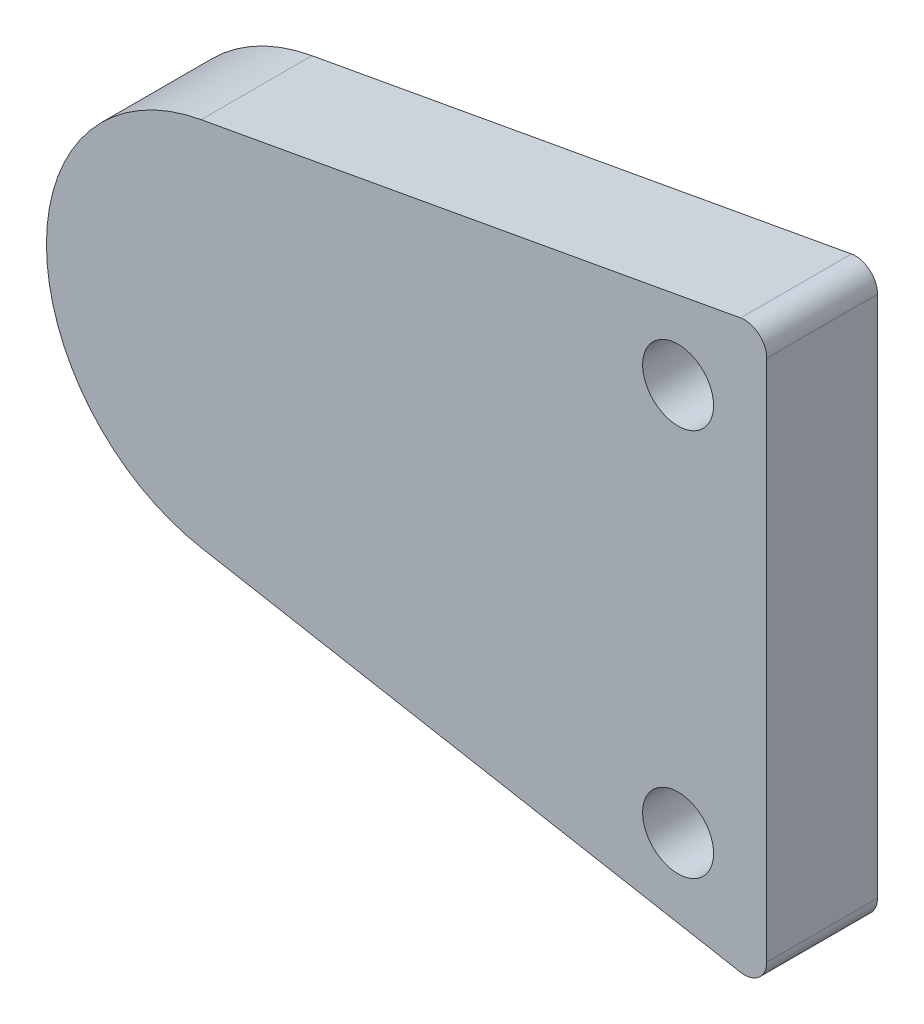
ISO-10303-21;
HEADER;
FILE_DESCRIPTION(('STEP AP214'),'2;1');
FILE_NAME('part.step','',(''),(''),'','','');
FILE_SCHEMA(('AUTOMOTIVE_DESIGN { 1 0 10303 214 1 1 1 1 }'));
ENDSEC;
DATA;
#1=APPLICATION_CONTEXT('core data for automotive mechanical design processes');
#2=APPLICATION_PROTOCOL_DEFINITION('international standard','automotive_design',2000,#1);
#3=PRODUCT_CONTEXT('',#1,'mechanical');
#4=PRODUCT('Part','Part','',(#3));
#5=PRODUCT_RELATED_PRODUCT_CATEGORY('part','',(#4));
#6=PRODUCT_DEFINITION_FORMATION('','',#4);
#7=PRODUCT_DEFINITION_CONTEXT('part definition',#1,'design');
#8=PRODUCT_DEFINITION('design','',#6,#7);
#9=PRODUCT_DEFINITION_SHAPE('','',#8);
#10=(LENGTH_UNIT() NAMED_UNIT(*) SI_UNIT(.MILLI.,.METRE.));
#11=(NAMED_UNIT(*) PLANE_ANGLE_UNIT() SI_UNIT($,.RADIAN.));
#12=(NAMED_UNIT(*) SI_UNIT($,.STERADIAN.) SOLID_ANGLE_UNIT());
#13=UNCERTAINTY_MEASURE_WITH_UNIT(LENGTH_MEASURE(1.E-05),#10,'distance_accuracy_value','');
#14=(GEOMETRIC_REPRESENTATION_CONTEXT(3) GLOBAL_UNCERTAINTY_ASSIGNED_CONTEXT((#13)) GLOBAL_UNIT_ASSIGNED_CONTEXT((#10,
#11,#12)) REPRESENTATION_CONTEXT('',''));
#15=CARTESIAN_POINT('',(0.,0.,0.));
#16=DIRECTION('',(0.,0.,1.));
#17=DIRECTION('',(1.,0.,0.));
#18=AXIS2_PLACEMENT_3D('',#15,#16,#17);
#19=CARTESIAN_POINT('',(0.,0.,0.));
#20=DIRECTION('',(0.,0.,1.));
#21=DIRECTION('',(1.,0.,0.));
#22=AXIS2_PLACEMENT_3D('',#19,#20,#21);
#23=PLANE('',#22);
#24=CARTESIAN_POINT('',(0.,0.,0.));
#25=DIRECTION('',(0.,0.,1.));
#26=DIRECTION('',(1.,0.,0.));
#27=AXIS2_PLACEMENT_3D('',#24,#25,#26);
#28=CIRCLE('',#27,8.5);
#29=CARTESIAN_POINT('',(-1.51957775732187,8.3630666289019,0.));
#30=VERTEX_POINT('',#29);
#31=CARTESIAN_POINT('',(-1.51957775732186,-8.3630666289019,0.));
#32=VERTEX_POINT('',#31);
#33=EDGE_CURVE('E96',#30,#32,#28,.T.);
#34=ORIENTED_EDGE('',*,*,#33,.F.);
#35=DIRECTION('',(-0.983890191635518,-0.178773853802572,0.));
#36=VECTOR('',#35,1.);
#37=CARTESIAN_POINT('',(-1.51957775732187,8.3630666289019,0.));
#38=LINE('',#37,#36);
#39=CARTESIAN_POINT('',(22.8212261461974,12.7858155855221,0.));
#40=VERTEX_POINT('',#39);
#41=EDGE_CURVE('E53',#40,#30,#38,.T.);
#42=ORIENTED_EDGE('',*,*,#41,.F.);
#43=CARTESIAN_POINT('',(23.,11.8019253938866,0.));
#44=DIRECTION('',(0.,0.,1.));
#45=DIRECTION('',(1.,0.,0.));
#46=AXIS2_PLACEMENT_3D('',#43,#44,#45);
#47=CIRCLE('',#46,1.);
#48=CARTESIAN_POINT('',(24.,11.8019253938866,0.));
#49=VERTEX_POINT('',#48);
#50=EDGE_CURVE('E61',#49,#40,#47,.T.);
#51=ORIENTED_EDGE('',*,*,#50,.F.);
#52=DIRECTION('',(0.,1.,0.));
#53=VECTOR('',#52,1.);
#54=CARTESIAN_POINT('',(24.,11.8019253938866,0.));
#55=LINE('',#54,#53);
#56=CARTESIAN_POINT('',(24.,-11.8019253938866,0.));
#57=VERTEX_POINT('',#56);
#58=EDGE_CURVE('E144',#57,#49,#55,.T.);
#59=ORIENTED_EDGE('',*,*,#58,.F.);
#60=CARTESIAN_POINT('',(23.,-11.8019253938866,0.));
#61=DIRECTION('',(0.,0.,1.));
#62=DIRECTION('',(-1.,0.,0.));
#63=AXIS2_PLACEMENT_3D('',#60,#61,#62);
#64=CIRCLE('',#63,1.);
#65=CARTESIAN_POINT('',(22.8212261461974,-12.7858155855221,0.));
#66=VERTEX_POINT('',#65);
#67=EDGE_CURVE('E142',#66,#57,#64,.T.);
#68=ORIENTED_EDGE('',*,*,#67,.F.);
#69=DIRECTION('',(0.983890191635518,-0.178773853802572,0.));
#70=VECTOR('',#69,1.);
#71=CARTESIAN_POINT('',(22.8212261461974,-12.7858155855221,0.));
#72=LINE('',#71,#70);
#73=EDGE_CURVE('E140',#32,#66,#72,.T.);
#74=ORIENTED_EDGE('',*,*,#73,.F.);
#75=EDGE_LOOP('',(#34,#42,#51,#59,#68,#74));
#76=FACE_BOUND('',#75,.T.);
#77=CARTESIAN_POINT('',(20.,8.75,0.));
#78=DIRECTION('',(0.,0.,1.));
#79=DIRECTION('',(1.,0.,0.));
#80=AXIS2_PLACEMENT_3D('',#77,#78,#79);
#81=CIRCLE('',#80,1.6);
#82=CARTESIAN_POINT('',(21.6,8.75,0.));
#83=VERTEX_POINT('',#82);
#84=EDGE_CURVE('E136',#83,#83,#81,.T.);
#85=ORIENTED_EDGE('',*,*,#84,.T.);
#86=EDGE_LOOP('',(#85));
#87=FACE_BOUND('',#86,.T.);
#88=CARTESIAN_POINT('',(20.,-8.75,0.));
#89=DIRECTION('',(0.,0.,1.));
#90=DIRECTION('',(1.,0.,0.));
#91=AXIS2_PLACEMENT_3D('',#88,#89,#90);
#92=CIRCLE('',#91,1.6);
#93=CARTESIAN_POINT('',(21.6,-8.75,0.));
#94=VERTEX_POINT('',#93);
#95=EDGE_CURVE('E133',#94,#94,#92,.T.);
#96=ORIENTED_EDGE('',*,*,#95,.T.);
#97=EDGE_LOOP('',(#96));
#98=FACE_BOUND('',#97,.T.);
#99=CARTESIAN_POINT('',(0.,0.,0.));
#100=DIRECTION('',(0.,0.,1.));
#101=DIRECTION('',(1.,0.,0.));
#102=AXIS2_PLACEMENT_3D('',#99,#100,#101);
#103=CIRCLE('',#102,5.5);
#104=CARTESIAN_POINT('',(5.5,0.,0.));
#105=VERTEX_POINT('',#104);
#106=EDGE_CURVE('E130',#105,#105,#103,.T.);
#107=ORIENTED_EDGE('',*,*,#106,.T.);
#108=EDGE_LOOP('',(#107));
#109=FACE_BOUND('',#108,.T.);
#110=ADVANCED_FACE('F38',(#76,#87,#98,#109),#23,.F.);
#111=CARTESIAN_POINT('',(0.,0.,2.5));
#112=DIRECTION('',(0.,0.,-1.));
#113=DIRECTION('',(-1.,0.,0.));
#114=AXIS2_PLACEMENT_3D('',#111,#112,#113);
#115=CYLINDRICAL_SURFACE('',#114,8.5);
#116=ORIENTED_EDGE('',*,*,#33,.T.);
#117=DIRECTION('',(0.,0.,-1.));
#118=VECTOR('',#117,1.);
#119=CARTESIAN_POINT('',(-1.51957775732186,-8.3630666289019,2.5));
#120=LINE('',#119,#118);
#121=CARTESIAN_POINT('',(-1.51957775732187,-8.3630666289019,5.));
#122=VERTEX_POINT('',#121);
#123=EDGE_CURVE('E11',#122,#32,#120,.T.);
#124=ORIENTED_EDGE('',*,*,#123,.F.);
#125=CARTESIAN_POINT('',(0.,0.,5.));
#126=DIRECTION('',(0.,0.,1.));
#127=DIRECTION('',(1.,0.,0.));
#128=AXIS2_PLACEMENT_3D('',#125,#126,#127);
#129=CIRCLE('',#128,8.5);
#130=CARTESIAN_POINT('',(-1.51957775732186,8.3630666289019,5.));
#131=VERTEX_POINT('',#130);
#132=EDGE_CURVE('E94',#131,#122,#129,.T.);
#133=ORIENTED_EDGE('',*,*,#132,.F.);
#134=DIRECTION('',(0.,0.,-1.));
#135=VECTOR('',#134,1.);
#136=CARTESIAN_POINT('',(-1.51957775732187,8.3630666289019,2.5));
#137=LINE('',#136,#135);
#138=EDGE_CURVE('E148',#131,#30,#137,.T.);
#139=ORIENTED_EDGE('',*,*,#138,.T.);
#140=EDGE_LOOP('',(#116,#124,#133,#139));
#141=FACE_BOUND('',#140,.T.);
#142=ADVANCED_FACE('F40',(#141),#115,.T.);
#143=CARTESIAN_POINT('',(22.8212261461974,-12.7858155855221,2.5));
#144=DIRECTION('',(0.178773853802572,0.983890191635518,0.));
#145=DIRECTION('',(-0.983890191635518,0.178773853802572,0.));
#146=AXIS2_PLACEMENT_3D('',#143,#144,#145);
#147=PLANE('',#146);
#148=ORIENTED_EDGE('',*,*,#73,.T.);
#149=DIRECTION('',(0.,0.,-1.));
#150=VECTOR('',#149,1.);
#151=CARTESIAN_POINT('',(22.8212261461974,-12.7858155855221,2.5));
#152=LINE('',#151,#150);
#153=CARTESIAN_POINT('',(22.8212261461974,-12.7858155855221,5.));
#154=VERTEX_POINT('',#153);
#155=EDGE_CURVE('E46',#154,#66,#152,.T.);
#156=ORIENTED_EDGE('',*,*,#155,.F.);
#157=DIRECTION('',(0.983890191635518,-0.178773853802572,0.));
#158=VECTOR('',#157,1.);
#159=CARTESIAN_POINT('',(-1.51957775732187,-8.3630666289019,5.));
#160=LINE('',#159,#158);
#161=EDGE_CURVE('E99',#122,#154,#160,.T.);
#162=ORIENTED_EDGE('',*,*,#161,.F.);
#163=ORIENTED_EDGE('',*,*,#123,.T.);
#164=EDGE_LOOP('',(#148,#156,#162,#163));
#165=FACE_BOUND('',#164,.T.);
#166=ADVANCED_FACE('F100',(#165),#147,.F.);
#167=CARTESIAN_POINT('',(23.,-11.8019253938866,2.5));
#168=DIRECTION('',(0.,0.,-1.));
#169=DIRECTION('',(-1.,0.,0.));
#170=AXIS2_PLACEMENT_3D('',#167,#168,#169);
#171=CYLINDRICAL_SURFACE('',#170,1.);
#172=ORIENTED_EDGE('',*,*,#67,.T.);
#173=DIRECTION('',(0.,0.,-1.));
#174=VECTOR('',#173,1.);
#175=CARTESIAN_POINT('',(24.,-11.8019253938866,2.5));
#176=LINE('',#175,#174);
#177=CARTESIAN_POINT('',(24.,-11.8019253938866,5.));
#178=VERTEX_POINT('',#177);
#179=EDGE_CURVE('E154',#178,#57,#176,.T.);
#180=ORIENTED_EDGE('',*,*,#179,.F.);
#181=CARTESIAN_POINT('',(23.,-11.8019253938866,5.));
#182=DIRECTION('',(0.,0.,1.));
#183=DIRECTION('',(1.,0.,0.));
#184=AXIS2_PLACEMENT_3D('',#181,#182,#183);
#185=CIRCLE('',#184,1.);
#186=EDGE_CURVE('E105',#154,#178,#185,.T.);
#187=ORIENTED_EDGE('',*,*,#186,.F.);
#188=ORIENTED_EDGE('',*,*,#155,.T.);
#189=EDGE_LOOP('',(#172,#180,#187,#188));
#190=FACE_BOUND('',#189,.T.);
#191=ADVANCED_FACE('F158',(#190),#171,.T.);
#192=CARTESIAN_POINT('',(24.,11.8019253938866,2.5));
#193=DIRECTION('',(-1.,0.,0.));
#194=DIRECTION('',(0.,0.,1.));
#195=AXIS2_PLACEMENT_3D('',#192,#193,#194);
#196=PLANE('',#195);
#197=ORIENTED_EDGE('',*,*,#58,.T.);
#198=DIRECTION('',(0.,0.,-1.));
#199=VECTOR('',#198,1.);
#200=CARTESIAN_POINT('',(24.,11.8019253938866,2.5));
#201=LINE('',#200,#199);
#202=CARTESIAN_POINT('',(24.,11.8019253938866,5.));
#203=VERTEX_POINT('',#202);
#204=EDGE_CURVE('E152',#203,#49,#201,.T.);
#205=ORIENTED_EDGE('',*,*,#204,.F.);
#206=DIRECTION('',(0.,1.,0.));
#207=VECTOR('',#206,1.);
#208=CARTESIAN_POINT('',(24.,-11.8019253938866,5.));
#209=LINE('',#208,#207);
#210=EDGE_CURVE('E121',#178,#203,#209,.T.);
#211=ORIENTED_EDGE('',*,*,#210,.F.);
#212=ORIENTED_EDGE('',*,*,#179,.T.);
#213=EDGE_LOOP('',(#197,#205,#211,#212));
#214=FACE_BOUND('',#213,.T.);
#215=ADVANCED_FACE('F163',(#214),#196,.F.);
#216=CARTESIAN_POINT('',(23.,11.8019253938866,2.5));
#217=DIRECTION('',(0.,0.,-1.));
#218=DIRECTION('',(-1.,0.,0.));
#219=AXIS2_PLACEMENT_3D('',#216,#217,#218);
#220=CYLINDRICAL_SURFACE('',#219,1.);
#221=ORIENTED_EDGE('',*,*,#50,.T.);
#222=DIRECTION('',(0.,0.,-1.));
#223=VECTOR('',#222,1.);
#224=CARTESIAN_POINT('',(22.8212261461974,12.7858155855221,2.5));
#225=LINE('',#224,#223);
#226=CARTESIAN_POINT('',(22.8212261461974,12.7858155855221,5.));
#227=VERTEX_POINT('',#226);
#228=EDGE_CURVE('E150',#227,#40,#225,.T.);
#229=ORIENTED_EDGE('',*,*,#228,.F.);
#230=CARTESIAN_POINT('',(23.,11.8019253938866,5.));
#231=DIRECTION('',(0.,0.,1.));
#232=DIRECTION('',(1.,0.,0.));
#233=AXIS2_PLACEMENT_3D('',#230,#231,#232);
#234=CIRCLE('',#233,1.);
#235=EDGE_CURVE('E124',#203,#227,#234,.T.);
#236=ORIENTED_EDGE('',*,*,#235,.F.);
#237=ORIENTED_EDGE('',*,*,#204,.T.);
#238=EDGE_LOOP('',(#221,#229,#236,#237));
#239=FACE_BOUND('',#238,.T.);
#240=ADVANCED_FACE('F166',(#239),#220,.T.);
#241=CARTESIAN_POINT('',(-1.51957775732187,8.3630666289019,2.5));
#242=DIRECTION('',(0.178773853802572,-0.983890191635518,0.));
#243=DIRECTION('',(0.983890191635518,0.178773853802572,0.));
#244=AXIS2_PLACEMENT_3D('',#241,#242,#243);
#245=PLANE('',#244);
#246=ORIENTED_EDGE('',*,*,#41,.T.);
#247=ORIENTED_EDGE('',*,*,#138,.F.);
#248=DIRECTION('',(-0.983890191635518,-0.178773853802572,0.));
#249=VECTOR('',#248,1.);
#250=CARTESIAN_POINT('',(22.8212261461974,12.7858155855221,5.));
#251=LINE('',#250,#249);
#252=EDGE_CURVE('E112',#227,#131,#251,.T.);
#253=ORIENTED_EDGE('',*,*,#252,.F.);
#254=ORIENTED_EDGE('',*,*,#228,.T.);
#255=EDGE_LOOP('',(#246,#247,#253,#254));
#256=FACE_BOUND('',#255,.T.);
#257=ADVANCED_FACE('F167',(#256),#245,.F.);
#258=CARTESIAN_POINT('',(20.,8.75,2.5));
#259=DIRECTION('',(0.,0.,-1.));
#260=DIRECTION('',(-1.,0.,0.));
#261=AXIS2_PLACEMENT_3D('',#258,#259,#260);
#262=CYLINDRICAL_SURFACE('',#261,1.6);
#263=ORIENTED_EDGE('',*,*,#84,.F.);
#264=EDGE_LOOP('',(#263));
#265=FACE_BOUND('',#264,.T.);
#266=CARTESIAN_POINT('',(20.,8.75,5.));
#267=DIRECTION('',(0.,0.,1.));
#268=DIRECTION('',(1.,0.,0.));
#269=AXIS2_PLACEMENT_3D('',#266,#267,#268);
#270=CIRCLE('',#269,1.6);
#271=CARTESIAN_POINT('',(21.6,8.75,5.));
#272=VERTEX_POINT('',#271);
#273=EDGE_CURVE('E116',#272,#272,#270,.T.);
#274=ORIENTED_EDGE('',*,*,#273,.T.);
#275=EDGE_LOOP('',(#274));
#276=FACE_BOUND('',#275,.T.);
#277=ADVANCED_FACE('F169',(#265,#276),#262,.F.);
#278=CARTESIAN_POINT('',(20.,-8.75,2.5));
#279=DIRECTION('',(0.,0.,-1.));
#280=DIRECTION('',(-1.,0.,0.));
#281=AXIS2_PLACEMENT_3D('',#278,#279,#280);
#282=CYLINDRICAL_SURFACE('',#281,1.6);
#283=ORIENTED_EDGE('',*,*,#95,.F.);
#284=EDGE_LOOP('',(#283));
#285=FACE_BOUND('',#284,.T.);
#286=CARTESIAN_POINT('',(20.,-8.75,5.));
#287=DIRECTION('',(0.,0.,1.));
#288=DIRECTION('',(1.,0.,0.));
#289=AXIS2_PLACEMENT_3D('',#286,#287,#288);
#290=CIRCLE('',#289,1.6);
#291=CARTESIAN_POINT('',(21.6,-8.75,5.));
#292=VERTEX_POINT('',#291);
#293=EDGE_CURVE('E113',#292,#292,#290,.T.);
#294=ORIENTED_EDGE('',*,*,#293,.T.);
#295=EDGE_LOOP('',(#294));
#296=FACE_BOUND('',#295,.T.);
#297=ADVANCED_FACE('F175',(#285,#296),#282,.F.);
#298=CARTESIAN_POINT('',(0.,0.,2.5));
#299=DIRECTION('',(0.,0.,-1.));
#300=DIRECTION('',(-1.,0.,0.));
#301=AXIS2_PLACEMENT_3D('',#298,#299,#300);
#302=CYLINDRICAL_SURFACE('',#301,5.5);
#303=CARTESIAN_POINT('',(0.,0.,2.5));
#304=DIRECTION('',(0.,0.,1.));
#305=DIRECTION('',(1.,0.,0.));
#306=AXIS2_PLACEMENT_3D('',#303,#304,#305);
#307=CIRCLE('',#306,5.5);
#308=CARTESIAN_POINT('',(5.5,0.,2.5));
#309=VERTEX_POINT('',#308);
#310=EDGE_CURVE('E127',#309,#309,#307,.T.);
#311=ORIENTED_EDGE('',*,*,#310,.T.);
#312=EDGE_LOOP('',(#311));
#313=FACE_BOUND('',#312,.T.);
#314=ORIENTED_EDGE('',*,*,#106,.F.);
#315=EDGE_LOOP('',(#314));
#316=FACE_BOUND('',#315,.T.);
#317=ADVANCED_FACE('F187',(#313,#316),#302,.F.);
#318=CARTESIAN_POINT('',(0.,0.,2.5));
#319=DIRECTION('',(0.,0.,1.));
#320=DIRECTION('',(1.,0.,0.));
#321=AXIS2_PLACEMENT_3D('',#318,#319,#320);
#322=PLANE('',#321);
#323=ORIENTED_EDGE('',*,*,#310,.F.);
#324=EDGE_LOOP('',(#323));
#325=FACE_BOUND('',#324,.T.);
#326=ADVANCED_FACE('F191',(#325),#322,.F.);
#327=CARTESIAN_POINT('',(0.,0.,5.));
#328=DIRECTION('',(0.,0.,1.));
#329=DIRECTION('',(1.,0.,0.));
#330=AXIS2_PLACEMENT_3D('',#327,#328,#329);
#331=PLANE('',#330);
#332=ORIENTED_EDGE('',*,*,#293,.F.);
#333=EDGE_LOOP('',(#332));
#334=FACE_BOUND('',#333,.T.);
#335=ORIENTED_EDGE('',*,*,#132,.T.);
#336=ORIENTED_EDGE('',*,*,#161,.T.);
#337=ORIENTED_EDGE('',*,*,#186,.T.);
#338=ORIENTED_EDGE('',*,*,#210,.T.);
#339=ORIENTED_EDGE('',*,*,#235,.T.);
#340=ORIENTED_EDGE('',*,*,#252,.T.);
#341=EDGE_LOOP('',(#335,#336,#337,#338,#339,#340));
#342=FACE_BOUND('',#341,.T.);
#343=ORIENTED_EDGE('',*,*,#273,.F.);
#344=EDGE_LOOP('',(#343));
#345=FACE_BOUND('',#344,.T.);
#346=ADVANCED_FACE('F108',(#334,#342,#345),#331,.T.);
#347=CLOSED_SHELL('',(#110,#142,#166,#191,#215,#240,#257,#277,#297,#317,#326,#346));
#348=MANIFOLD_SOLID_BREP('B2',#347);
#349=ADVANCED_BREP_SHAPE_REPRESENTATION('',(#18,#348),#14);
#350=SHAPE_DEFINITION_REPRESENTATION(#9,#349);
ENDSEC;
END-ISO-10303-21;
